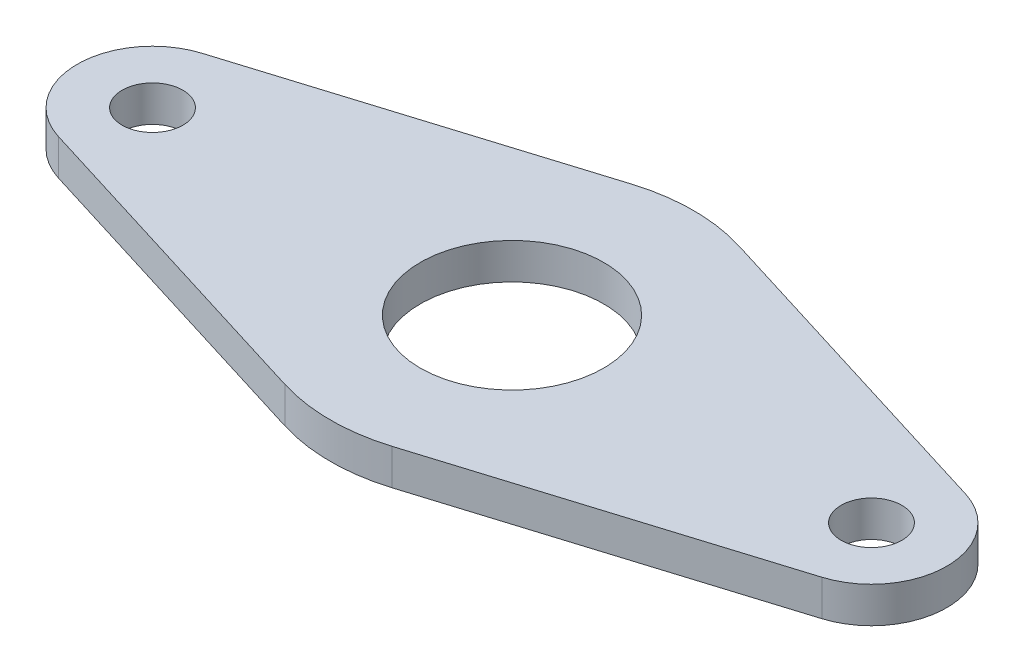
ISO-10303-21;
HEADER;
FILE_DESCRIPTION(('STEP AP214'),'2;1');
FILE_NAME('part.step','',(''),(''),'','','');
FILE_SCHEMA(('AUTOMOTIVE_DESIGN { 1 0 10303 214 1 1 1 1 }'));
ENDSEC;
DATA;
#1=APPLICATION_CONTEXT('core data for automotive mechanical design processes');
#2=APPLICATION_PROTOCOL_DEFINITION('international standard','automotive_design',2000,#1);
#3=PRODUCT_CONTEXT('',#1,'mechanical');
#4=PRODUCT('Part','Part','',(#3));
#5=PRODUCT_RELATED_PRODUCT_CATEGORY('part','',(#4));
#6=PRODUCT_DEFINITION_FORMATION('','',#4);
#7=PRODUCT_DEFINITION_CONTEXT('part definition',#1,'design');
#8=PRODUCT_DEFINITION('design','',#6,#7);
#9=PRODUCT_DEFINITION_SHAPE('','',#8);
#10=(LENGTH_UNIT() NAMED_UNIT(*) SI_UNIT(.MILLI.,.METRE.));
#11=(NAMED_UNIT(*) PLANE_ANGLE_UNIT() SI_UNIT($,.RADIAN.));
#12=(NAMED_UNIT(*) SI_UNIT($,.STERADIAN.) SOLID_ANGLE_UNIT());
#13=UNCERTAINTY_MEASURE_WITH_UNIT(LENGTH_MEASURE(1.E-05),#10,'distance_accuracy_value','');
#14=(GEOMETRIC_REPRESENTATION_CONTEXT(3) GLOBAL_UNCERTAINTY_ASSIGNED_CONTEXT((#13)) GLOBAL_UNIT_ASSIGNED_CONTEXT((#10,
#11,#12)) REPRESENTATION_CONTEXT('',''));
#15=CARTESIAN_POINT('',(0.,0.,0.));
#16=DIRECTION('',(0.,0.,1.));
#17=DIRECTION('',(1.,0.,0.));
#18=AXIS2_PLACEMENT_3D('',#15,#16,#17);
#19=CARTESIAN_POINT('',(-3.7903785,2.54,12.2541813201347));
#20=DIRECTION('',(0.2955,0.,-0.955342739544296));
#21=DIRECTION('',(-0.955342739544296,0.,-0.2955));
#22=AXIS2_PLACEMENT_3D('',#19,#20,#21);
#23=PLANE('',#22);
#24=DIRECTION('',(0.955342739544296,0.,0.2955));
#25=VECTOR('',#24,1.);
#26=CARTESIAN_POINT('',(-3.7903785,0.,12.2541813201347));
#27=LINE('',#26,#25);
#28=CARTESIAN_POINT('',(-26.97244415,0.,5.08366531993707));
#29=VERTEX_POINT('',#28);
#30=CARTESIAN_POINT('',(-3.7903785,0.,12.2541813201347));
#31=VERTEX_POINT('',#30);
#32=EDGE_CURVE('E145',#29,#31,#27,.T.);
#33=ORIENTED_EDGE('',*,*,#32,.T.);
#34=DIRECTION('',(0.,-1.,0.));
#35=VECTOR('',#34,1.);
#36=CARTESIAN_POINT('',(-3.7903785,2.54,12.2541813201347));
#37=LINE('',#36,#35);
#38=CARTESIAN_POINT('',(-3.7903785,2.54,12.2541813201347));
#39=VERTEX_POINT('',#38);
#40=EDGE_CURVE('E11',#39,#31,#37,.T.);
#41=ORIENTED_EDGE('',*,*,#40,.F.);
#42=DIRECTION('',(0.955342739544296,0.,0.2955));
#43=VECTOR('',#42,1.);
#44=CARTESIAN_POINT('',(-3.7903785,2.54,12.2541813201347));
#45=LINE('',#44,#43);
#46=CARTESIAN_POINT('',(-26.97244415,2.54,5.08366531993707));
#47=VERTEX_POINT('',#46);
#48=EDGE_CURVE('E173',#47,#39,#45,.T.);
#49=ORIENTED_EDGE('',*,*,#48,.F.);
#50=DIRECTION('',(0.,-1.,0.));
#51=VECTOR('',#50,1.);
#52=CARTESIAN_POINT('',(-26.97244415,2.54,5.08366531993707));
#53=LINE('',#52,#51);
#54=EDGE_CURVE('E144',#47,#29,#53,.T.);
#55=ORIENTED_EDGE('',*,*,#54,.T.);
#56=EDGE_LOOP('',(#33,#41,#49,#55));
#57=FACE_BOUND('',#56,.T.);
#58=ADVANCED_FACE('F39',(#57),#23,.F.);
#59=CARTESIAN_POINT('',(0.,2.54,0.));
#60=DIRECTION('',(0.,-1.,0.));
#61=DIRECTION('',(0.,0.,-1.));
#62=AXIS2_PLACEMENT_3D('',#59,#60,#61);
#63=CYLINDRICAL_SURFACE('',#62,12.827);
#64=CARTESIAN_POINT('',(0.,0.,0.));
#65=DIRECTION('',(0.,1.,0.));
#66=DIRECTION('',(0.,0.,1.));
#67=AXIS2_PLACEMENT_3D('',#64,#65,#66);
#68=CIRCLE('',#67,12.827);
#69=CARTESIAN_POINT('',(3.79037850000001,0.,12.2541813201347));
#70=VERTEX_POINT('',#69);
#71=EDGE_CURVE('E148',#31,#70,#68,.T.);
#72=ORIENTED_EDGE('',*,*,#71,.T.);
#73=DIRECTION('',(0.,-1.,0.));
#74=VECTOR('',#73,1.);
#75=CARTESIAN_POINT('',(3.79037850000001,2.54,12.2541813201347));
#76=LINE('',#75,#74);
#77=CARTESIAN_POINT('',(3.79037850000001,2.54,12.2541813201347));
#78=VERTEX_POINT('',#77);
#79=EDGE_CURVE('E47',#78,#70,#76,.T.);
#80=ORIENTED_EDGE('',*,*,#79,.F.);
#81=CARTESIAN_POINT('',(0.,2.54,0.));
#82=DIRECTION('',(0.,1.,0.));
#83=DIRECTION('',(0.,0.,1.));
#84=AXIS2_PLACEMENT_3D('',#81,#82,#83);
#85=CIRCLE('',#84,12.827);
#86=EDGE_CURVE('E94',#39,#78,#85,.T.);
#87=ORIENTED_EDGE('',*,*,#86,.F.);
#88=ORIENTED_EDGE('',*,*,#40,.T.);
#89=EDGE_LOOP('',(#72,#80,#87,#88));
#90=FACE_BOUND('',#89,.T.);
#91=ADVANCED_FACE('F186',(#90),#63,.T.);
#92=CARTESIAN_POINT('',(3.79037850000001,2.54,12.2541813201347));
#93=DIRECTION('',(0.295500000000001,0.,0.955342739544295));
#94=DIRECTION('',(0.955342739544296,0.,-0.295500000000001));
#95=AXIS2_PLACEMENT_3D('',#92,#93,#94);
#96=PLANE('',#95);
#97=DIRECTION('',(-0.955342739544296,0.,0.295500000000001));
#98=VECTOR('',#97,1.);
#99=CARTESIAN_POINT('',(3.79037850000001,0.,12.2541813201347));
#100=LINE('',#99,#98);
#101=CARTESIAN_POINT('',(26.97244415,0.,5.08366531993705));
#102=VERTEX_POINT('',#101);
#103=EDGE_CURVE('E151',#102,#70,#100,.T.);
#104=ORIENTED_EDGE('',*,*,#103,.F.);
#105=DIRECTION('',(0.,-1.,0.));
#106=VECTOR('',#105,1.);
#107=CARTESIAN_POINT('',(26.97244415,2.54,5.08366531993705));
#108=LINE('',#107,#106);
#109=CARTESIAN_POINT('',(26.97244415,2.54,5.08366531993705));
#110=VERTEX_POINT('',#109);
#111=EDGE_CURVE('E179',#110,#102,#108,.T.);
#112=ORIENTED_EDGE('',*,*,#111,.F.);
#113=DIRECTION('',(-0.955342739544296,0.,0.295500000000001));
#114=VECTOR('',#113,1.);
#115=CARTESIAN_POINT('',(3.79037850000001,2.54,12.2541813201347));
#116=LINE('',#115,#114);
#117=EDGE_CURVE('E185',#110,#78,#116,.T.);
#118=ORIENTED_EDGE('',*,*,#117,.T.);
#119=ORIENTED_EDGE('',*,*,#79,.T.);
#120=EDGE_LOOP('',(#104,#112,#118,#119));
#121=FACE_BOUND('',#120,.T.);
#122=ADVANCED_FACE('F183',(#121),#96,.T.);
#123=CARTESIAN_POINT('',(25.4,2.54,0.));
#124=DIRECTION('',(0.,-1.,0.));
#125=DIRECTION('',(0.,0.,-1.));
#126=AXIS2_PLACEMENT_3D('',#123,#124,#125);
#127=CYLINDRICAL_SURFACE('',#126,5.3213);
#128=CARTESIAN_POINT('',(25.4,0.,0.));
#129=DIRECTION('',(0.,1.,0.));
#130=DIRECTION('',(0.,0.,1.));
#131=AXIS2_PLACEMENT_3D('',#128,#129,#130);
#132=CIRCLE('',#131,5.3213);
#133=CARTESIAN_POINT('',(26.97244415,0.,-5.08366531993707));
#134=VERTEX_POINT('',#133);
#135=EDGE_CURVE('E154',#102,#134,#132,.T.);
#136=ORIENTED_EDGE('',*,*,#135,.T.);
#137=DIRECTION('',(0.,-1.,0.));
#138=VECTOR('',#137,1.);
#139=CARTESIAN_POINT('',(26.97244415,2.54,-5.08366531993707));
#140=LINE('',#139,#138);
#141=CARTESIAN_POINT('',(26.97244415,2.54,-5.08366531993707));
#142=VERTEX_POINT('',#141);
#143=EDGE_CURVE('E177',#142,#134,#140,.T.);
#144=ORIENTED_EDGE('',*,*,#143,.F.);
#145=CARTESIAN_POINT('',(25.4,2.54,0.));
#146=DIRECTION('',(0.,1.,0.));
#147=DIRECTION('',(0.,0.,1.));
#148=AXIS2_PLACEMENT_3D('',#145,#146,#147);
#149=CIRCLE('',#148,5.3213);
#150=EDGE_CURVE('E198',#110,#142,#149,.T.);
#151=ORIENTED_EDGE('',*,*,#150,.F.);
#152=ORIENTED_EDGE('',*,*,#111,.T.);
#153=EDGE_LOOP('',(#136,#144,#151,#152));
#154=FACE_BOUND('',#153,.T.);
#155=ADVANCED_FACE('F196',(#154),#127,.T.);
#156=CARTESIAN_POINT('',(3.79037849999999,2.54,-12.2541813201347));
#157=DIRECTION('',(0.2955,0.,-0.955342739544296));
#158=DIRECTION('',(-0.955342739544296,0.,-0.2955));
#159=AXIS2_PLACEMENT_3D('',#156,#157,#158);
#160=PLANE('',#159);
#161=DIRECTION('',(0.955342739544296,0.,0.2955));
#162=VECTOR('',#161,1.);
#163=CARTESIAN_POINT('',(3.79037849999999,0.,-12.2541813201347));
#164=LINE('',#163,#162);
#165=CARTESIAN_POINT('',(3.79037849999999,0.,-12.2541813201347));
#166=VERTEX_POINT('',#165);
#167=EDGE_CURVE('E157',#166,#134,#164,.T.);
#168=ORIENTED_EDGE('',*,*,#167,.F.);
#169=DIRECTION('',(0.,-1.,0.));
#170=VECTOR('',#169,1.);
#171=CARTESIAN_POINT('',(3.79037849999999,2.54,-12.2541813201347));
#172=LINE('',#171,#170);
#173=CARTESIAN_POINT('',(3.79037849999999,2.54,-12.2541813201347));
#174=VERTEX_POINT('',#173);
#175=EDGE_CURVE('E126',#174,#166,#172,.T.);
#176=ORIENTED_EDGE('',*,*,#175,.F.);
#177=DIRECTION('',(0.955342739544296,0.,0.2955));
#178=VECTOR('',#177,1.);
#179=CARTESIAN_POINT('',(3.79037849999999,2.54,-12.2541813201347));
#180=LINE('',#179,#178);
#181=EDGE_CURVE('E115',#174,#142,#180,.T.);
#182=ORIENTED_EDGE('',*,*,#181,.T.);
#183=ORIENTED_EDGE('',*,*,#143,.T.);
#184=EDGE_LOOP('',(#168,#176,#182,#183));
#185=FACE_BOUND('',#184,.T.);
#186=ADVANCED_FACE('F204',(#185),#160,.T.);
#187=CARTESIAN_POINT('',(-3.7903785,0.,-12.2541813201347));
#188=VERTEX_POINT('',#187);
#189=EDGE_CURVE('E122',#166,#188,#68,.T.);
#190=ORIENTED_EDGE('',*,*,#189,.T.);
#191=DIRECTION('',(0.,-1.,0.));
#192=VECTOR('',#191,1.);
#193=CARTESIAN_POINT('',(-3.7903785,2.54,-12.2541813201347));
#194=LINE('',#193,#192);
#195=CARTESIAN_POINT('',(-3.7903785,2.54,-12.2541813201347));
#196=VERTEX_POINT('',#195);
#197=EDGE_CURVE('E119',#196,#188,#194,.T.);
#198=ORIENTED_EDGE('',*,*,#197,.F.);
#199=EDGE_CURVE('E108',#174,#196,#85,.T.);
#200=ORIENTED_EDGE('',*,*,#199,.F.);
#201=ORIENTED_EDGE('',*,*,#175,.T.);
#202=EDGE_LOOP('',(#190,#198,#200,#201));
#203=FACE_BOUND('',#202,.T.);
#204=ADVANCED_FACE('F120',(#203),#63,.T.);
#205=CARTESIAN_POINT('',(-3.7903785,2.54,-12.2541813201347));
#206=DIRECTION('',(-0.2955,0.,-0.955342739544296));
#207=DIRECTION('',(-0.955342739544296,0.,0.2955));
#208=AXIS2_PLACEMENT_3D('',#205,#206,#207);
#209=PLANE('',#208);
#210=DIRECTION('',(0.955342739544296,0.,-0.2955));
#211=VECTOR('',#210,1.);
#212=CARTESIAN_POINT('',(-3.7903785,0.,-12.2541813201347));
#213=LINE('',#212,#211);
#214=CARTESIAN_POINT('',(-26.97244415,0.,-5.08366531993705));
#215=VERTEX_POINT('',#214);
#216=EDGE_CURVE('E160',#215,#188,#213,.T.);
#217=ORIENTED_EDGE('',*,*,#216,.F.);
#218=DIRECTION('',(0.,-1.,0.));
#219=VECTOR('',#218,1.);
#220=CARTESIAN_POINT('',(-26.97244415,2.54,-5.08366531993705));
#221=LINE('',#220,#219);
#222=CARTESIAN_POINT('',(-26.97244415,2.54,-5.08366531993705));
#223=VERTEX_POINT('',#222);
#224=EDGE_CURVE('E83',#223,#215,#221,.T.);
#225=ORIENTED_EDGE('',*,*,#224,.F.);
#226=DIRECTION('',(0.955342739544296,0.,-0.2955));
#227=VECTOR('',#226,1.);
#228=CARTESIAN_POINT('',(-3.7903785,2.54,-12.2541813201347));
#229=LINE('',#228,#227);
#230=EDGE_CURVE('E113',#223,#196,#229,.T.);
#231=ORIENTED_EDGE('',*,*,#230,.T.);
#232=ORIENTED_EDGE('',*,*,#197,.T.);
#233=EDGE_LOOP('',(#217,#225,#231,#232));
#234=FACE_BOUND('',#233,.T.);
#235=ADVANCED_FACE('F128',(#234),#209,.T.);
#236=CARTESIAN_POINT('',(0.,2.54,0.));
#237=DIRECTION('',(0.,-1.,0.));
#238=DIRECTION('',(0.,0.,-1.));
#239=AXIS2_PLACEMENT_3D('',#236,#237,#238);
#240=CYLINDRICAL_SURFACE('',#239,6.477);
#241=CARTESIAN_POINT('',(0.,2.54,0.));
#242=DIRECTION('',(0.,1.,0.));
#243=DIRECTION('',(0.,0.,1.));
#244=AXIS2_PLACEMENT_3D('',#241,#242,#243);
#245=CIRCLE('',#244,6.477);
#246=CARTESIAN_POINT('',(0.,2.54,6.477));
#247=VERTEX_POINT('',#246);
#248=EDGE_CURVE('E137',#247,#247,#245,.T.);
#249=ORIENTED_EDGE('',*,*,#248,.T.);
#250=EDGE_LOOP('',(#249));
#251=FACE_BOUND('',#250,.T.);
#252=CARTESIAN_POINT('',(0.,0.,0.));
#253=DIRECTION('',(0.,1.,0.));
#254=DIRECTION('',(0.,0.,1.));
#255=AXIS2_PLACEMENT_3D('',#252,#253,#254);
#256=CIRCLE('',#255,6.477);
#257=CARTESIAN_POINT('',(0.,0.,6.477));
#258=VERTEX_POINT('',#257);
#259=EDGE_CURVE('E166',#258,#258,#256,.T.);
#260=ORIENTED_EDGE('',*,*,#259,.F.);
#261=EDGE_LOOP('',(#260));
#262=FACE_BOUND('',#261,.T.);
#263=ADVANCED_FACE('F223',(#251,#262),#240,.F.);
#264=CARTESIAN_POINT('',(-25.4,2.54,0.));
#265=DIRECTION('',(0.,-1.,0.));
#266=DIRECTION('',(0.,0.,-1.));
#267=AXIS2_PLACEMENT_3D('',#264,#265,#266);
#268=CYLINDRICAL_SURFACE('',#267,2.1463);
#269=CARTESIAN_POINT('',(-25.4,2.54,0.));
#270=DIRECTION('',(0.,1.,0.));
#271=DIRECTION('',(0.,0.,1.));
#272=AXIS2_PLACEMENT_3D('',#269,#270,#271);
#273=CIRCLE('',#272,2.1463);
#274=CARTESIAN_POINT('',(-25.4,2.54,2.14630000000001));
#275=VERTEX_POINT('',#274);
#276=EDGE_CURVE('E130',#275,#275,#273,.T.);
#277=ORIENTED_EDGE('',*,*,#276,.T.);
#278=EDGE_LOOP('',(#277));
#279=FACE_BOUND('',#278,.T.);
#280=CARTESIAN_POINT('',(-25.4,0.,0.));
#281=DIRECTION('',(0.,1.,0.));
#282=DIRECTION('',(0.,0.,1.));
#283=AXIS2_PLACEMENT_3D('',#280,#281,#282);
#284=CIRCLE('',#283,2.1463);
#285=CARTESIAN_POINT('',(-25.4,0.,2.14630000000001));
#286=VERTEX_POINT('',#285);
#287=EDGE_CURVE('E163',#286,#286,#284,.T.);
#288=ORIENTED_EDGE('',*,*,#287,.F.);
#289=EDGE_LOOP('',(#288));
#290=FACE_BOUND('',#289,.T.);
#291=ADVANCED_FACE('F228',(#279,#290),#268,.F.);
#292=CARTESIAN_POINT('',(-25.4,2.54,0.));
#293=DIRECTION('',(0.,-1.,0.));
#294=DIRECTION('',(0.,0.,-1.));
#295=AXIS2_PLACEMENT_3D('',#292,#293,#294);
#296=CYLINDRICAL_SURFACE('',#295,5.3213);
#297=CARTESIAN_POINT('',(-25.4,0.,0.));
#298=DIRECTION('',(0.,1.,0.));
#299=DIRECTION('',(0.,0.,1.));
#300=AXIS2_PLACEMENT_3D('',#297,#298,#299);
#301=CIRCLE('',#300,5.3213);
#302=EDGE_CURVE('E86',#215,#29,#301,.T.);
#303=ORIENTED_EDGE('',*,*,#302,.T.);
#304=ORIENTED_EDGE('',*,*,#54,.F.);
#305=CARTESIAN_POINT('',(-25.4,2.54,0.));
#306=DIRECTION('',(0.,1.,0.));
#307=DIRECTION('',(0.,0.,1.));
#308=AXIS2_PLACEMENT_3D('',#305,#306,#307);
#309=CIRCLE('',#308,5.3213);
#310=EDGE_CURVE('E55',#223,#47,#309,.T.);
#311=ORIENTED_EDGE('',*,*,#310,.F.);
#312=ORIENTED_EDGE('',*,*,#224,.T.);
#313=EDGE_LOOP('',(#303,#304,#311,#312));
#314=FACE_BOUND('',#313,.T.);
#315=ADVANCED_FACE('F224',(#314),#296,.T.);
#316=CARTESIAN_POINT('',(25.4,2.54,0.));
#317=DIRECTION('',(0.,-1.,0.));
#318=DIRECTION('',(0.,0.,-1.));
#319=AXIS2_PLACEMENT_3D('',#316,#317,#318);
#320=CYLINDRICAL_SURFACE('',#319,2.1463);
#321=CARTESIAN_POINT('',(25.4,2.54,0.));
#322=DIRECTION('',(0.,1.,0.));
#323=DIRECTION('',(0.,0.,1.));
#324=AXIS2_PLACEMENT_3D('',#321,#322,#323);
#325=CIRCLE('',#324,2.1463);
#326=CARTESIAN_POINT('',(25.4,2.54,2.14629999999999));
#327=VERTEX_POINT('',#326);
#328=EDGE_CURVE('E141',#327,#327,#325,.T.);
#329=ORIENTED_EDGE('',*,*,#328,.T.);
#330=EDGE_LOOP('',(#329));
#331=FACE_BOUND('',#330,.T.);
#332=CARTESIAN_POINT('',(25.4,0.,0.));
#333=DIRECTION('',(0.,1.,0.));
#334=DIRECTION('',(0.,0.,1.));
#335=AXIS2_PLACEMENT_3D('',#332,#333,#334);
#336=CIRCLE('',#335,2.1463);
#337=CARTESIAN_POINT('',(25.4,0.,2.14629999999999));
#338=VERTEX_POINT('',#337);
#339=EDGE_CURVE('E170',#338,#338,#336,.T.);
#340=ORIENTED_EDGE('',*,*,#339,.F.);
#341=EDGE_LOOP('',(#340));
#342=FACE_BOUND('',#341,.T.);
#343=ADVANCED_FACE('F227',(#331,#342),#320,.F.);
#344=CARTESIAN_POINT('',(0.,2.54,0.));
#345=DIRECTION('',(0.,1.,0.));
#346=DIRECTION('',(0.,0.,1.));
#347=AXIS2_PLACEMENT_3D('',#344,#345,#346);
#348=PLANE('',#347);
#349=ORIENTED_EDGE('',*,*,#48,.T.);
#350=ORIENTED_EDGE('',*,*,#86,.T.);
#351=ORIENTED_EDGE('',*,*,#117,.F.);
#352=ORIENTED_EDGE('',*,*,#150,.T.);
#353=ORIENTED_EDGE('',*,*,#181,.F.);
#354=ORIENTED_EDGE('',*,*,#199,.T.);
#355=ORIENTED_EDGE('',*,*,#230,.F.);
#356=ORIENTED_EDGE('',*,*,#310,.T.);
#357=EDGE_LOOP('',(#349,#350,#351,#352,#353,#354,#355,#356));
#358=FACE_BOUND('',#357,.T.);
#359=ORIENTED_EDGE('',*,*,#276,.F.);
#360=EDGE_LOOP('',(#359));
#361=FACE_BOUND('',#360,.T.);
#362=ORIENTED_EDGE('',*,*,#248,.F.);
#363=EDGE_LOOP('',(#362));
#364=FACE_BOUND('',#363,.T.);
#365=ORIENTED_EDGE('',*,*,#328,.F.);
#366=EDGE_LOOP('',(#365));
#367=FACE_BOUND('',#366,.T.);
#368=ADVANCED_FACE('F110',(#358,#361,#364,#367),#348,.T.);
#369=CARTESIAN_POINT('',(0.,0.,0.));
#370=DIRECTION('',(0.,1.,0.));
#371=DIRECTION('',(0.,0.,1.));
#372=AXIS2_PLACEMENT_3D('',#369,#370,#371);
#373=PLANE('',#372);
#374=ORIENTED_EDGE('',*,*,#32,.F.);
#375=ORIENTED_EDGE('',*,*,#302,.F.);
#376=ORIENTED_EDGE('',*,*,#216,.T.);
#377=ORIENTED_EDGE('',*,*,#189,.F.);
#378=ORIENTED_EDGE('',*,*,#167,.T.);
#379=ORIENTED_EDGE('',*,*,#135,.F.);
#380=ORIENTED_EDGE('',*,*,#103,.T.);
#381=ORIENTED_EDGE('',*,*,#71,.F.);
#382=EDGE_LOOP('',(#374,#375,#376,#377,#378,#379,#380,#381));
#383=FACE_BOUND('',#382,.T.);
#384=ORIENTED_EDGE('',*,*,#287,.T.);
#385=EDGE_LOOP('',(#384));
#386=FACE_BOUND('',#385,.T.);
#387=ORIENTED_EDGE('',*,*,#259,.T.);
#388=EDGE_LOOP('',(#387));
#389=FACE_BOUND('',#388,.T.);
#390=ORIENTED_EDGE('',*,*,#339,.T.);
#391=EDGE_LOOP('',(#390));
#392=FACE_BOUND('',#391,.T.);
#393=ADVANCED_FACE('F191',(#383,#386,#389,#392),#373,.F.);
#394=CLOSED_SHELL('',(#58,#91,#122,#155,#186,#204,#235,#263,#291,#315,#343,#368,#393));
#395=MANIFOLD_SOLID_BREP('B2',#394);
#396=ADVANCED_BREP_SHAPE_REPRESENTATION('',(#18,#395),#14);
#397=SHAPE_DEFINITION_REPRESENTATION(#9,#396);
ENDSEC;
END-ISO-10303-21;
